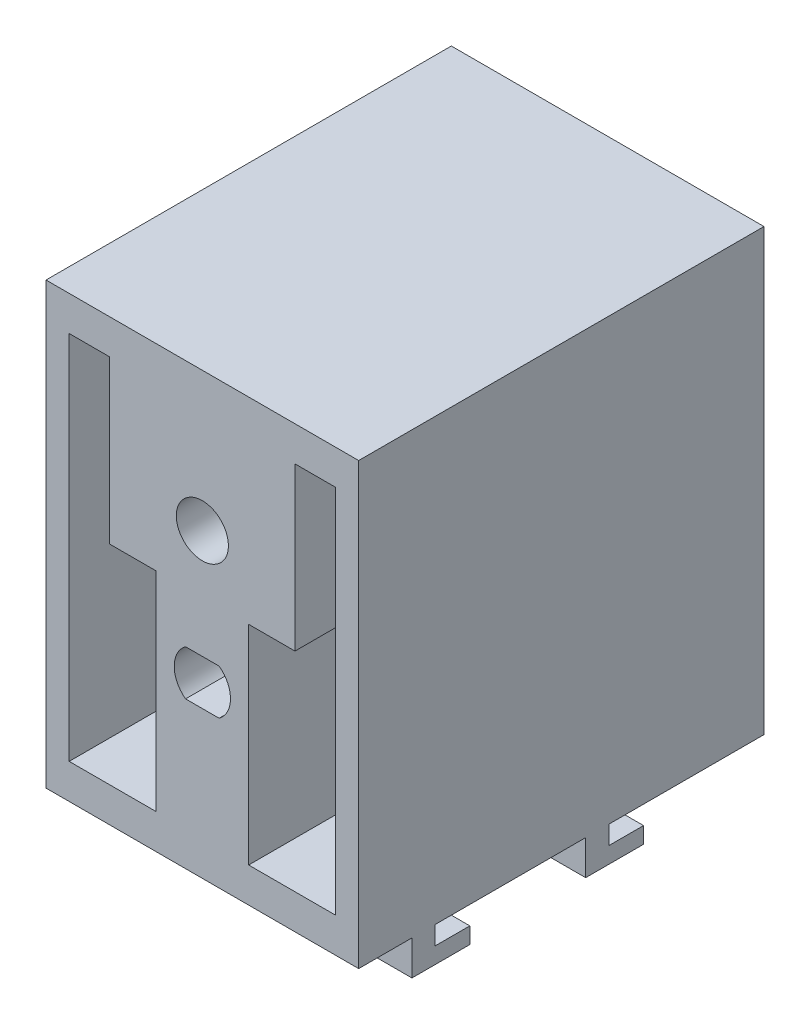
ISO-10303-21;
HEADER;
FILE_DESCRIPTION(('STEP AP214'),'2;1');
FILE_NAME('part.step','',(''),(''),'','','');
FILE_SCHEMA(('AUTOMOTIVE_DESIGN { 1 0 10303 214 1 1 1 1 }'));
ENDSEC;
DATA;
#1=APPLICATION_CONTEXT('core data for automotive mechanical design processes');
#2=APPLICATION_PROTOCOL_DEFINITION('international standard','automotive_design',2000,#1);
#3=PRODUCT_CONTEXT('',#1,'mechanical');
#4=PRODUCT('Part','Part','',(#3));
#5=PRODUCT_RELATED_PRODUCT_CATEGORY('part','',(#4));
#6=PRODUCT_DEFINITION_FORMATION('','',#4);
#7=PRODUCT_DEFINITION_CONTEXT('part definition',#1,'design');
#8=PRODUCT_DEFINITION('design','',#6,#7);
#9=PRODUCT_DEFINITION_SHAPE('','',#8);
#10=(LENGTH_UNIT() NAMED_UNIT(*) SI_UNIT(.MILLI.,.METRE.));
#11=(NAMED_UNIT(*) PLANE_ANGLE_UNIT() SI_UNIT($,.RADIAN.));
#12=(NAMED_UNIT(*) SI_UNIT($,.STERADIAN.) SOLID_ANGLE_UNIT());
#13=UNCERTAINTY_MEASURE_WITH_UNIT(LENGTH_MEASURE(1.E-05),#10,'distance_accuracy_value','');
#14=(GEOMETRIC_REPRESENTATION_CONTEXT(3) GLOBAL_UNCERTAINTY_ASSIGNED_CONTEXT((#13)) GLOBAL_UNIT_ASSIGNED_CONTEXT((#10,
#11,#12)) REPRESENTATION_CONTEXT('',''));
#15=CARTESIAN_POINT('',(0.,0.,0.));
#16=DIRECTION('',(0.,0.,1.));
#17=DIRECTION('',(1.,0.,0.));
#18=AXIS2_PLACEMENT_3D('',#15,#16,#17);
#19=CARTESIAN_POINT('',(-63.5,88.9,0.));
#20=DIRECTION('',(0.,1.,0.));
#21=DIRECTION('',(0.,0.,1.));
#22=AXIS2_PLACEMENT_3D('',#19,#20,#21);
#23=PLANE('',#22);
#24=DIRECTION('',(0.,0.,-1.));
#25=VECTOR('',#24,1.);
#26=CARTESIAN_POINT('',(-54.61,88.9,74.168));
#27=LINE('',#26,#25);
#28=CARTESIAN_POINT('',(-54.61,88.9,88.9));
#29=VERTEX_POINT('',#28);
#30=CARTESIAN_POINT('',(-54.61,88.9,61.468));
#31=VERTEX_POINT('',#30);
#32=EDGE_CURVE('E62',#29,#31,#27,.T.);
#33=ORIENTED_EDGE('',*,*,#32,.F.);
#34=DIRECTION('',(-1.,0.,0.));
#35=VECTOR('',#34,1.);
#36=CARTESIAN_POINT('',(-63.5,88.9,88.9));
#37=LINE('',#36,#35);
#38=CARTESIAN_POINT('',(-63.5,88.9,88.9));
#39=VERTEX_POINT('',#38);
#40=EDGE_CURVE('E600',#29,#39,#37,.T.);
#41=ORIENTED_EDGE('',*,*,#40,.T.);
#42=DIRECTION('',(0.,0.,1.));
#43=VECTOR('',#42,1.);
#44=CARTESIAN_POINT('',(-63.5,88.9,0.));
#45=LINE('',#44,#43);
#46=CARTESIAN_POINT('',(-63.5,88.9,0.));
#47=VERTEX_POINT('',#46);
#48=EDGE_CURVE('E603',#47,#39,#45,.T.);
#49=ORIENTED_EDGE('',*,*,#48,.F.);
#50=DIRECTION('',(-1.,0.,0.));
#51=VECTOR('',#50,1.);
#52=CARTESIAN_POINT('',(-63.5,88.9,0.));
#53=LINE('',#52,#51);
#54=CARTESIAN_POINT('',(-5.08,88.9,0.));
#55=VERTEX_POINT('',#54);
#56=EDGE_CURVE('E584',#55,#47,#53,.T.);
#57=ORIENTED_EDGE('',*,*,#56,.F.);
#58=DIRECTION('',(0.,0.,1.));
#59=VECTOR('',#58,1.);
#60=CARTESIAN_POINT('',(-5.08,88.9,0.));
#61=LINE('',#60,#59);
#62=CARTESIAN_POINT('',(-5.08,88.9,88.9));
#63=VERTEX_POINT('',#62);
#64=EDGE_CURVE('E608',#55,#63,#61,.T.);
#65=ORIENTED_EDGE('',*,*,#64,.T.);
#66=CARTESIAN_POINT('',(-13.97,88.9,88.9));
#67=VERTEX_POINT('',#66);
#68=EDGE_CURVE('E576',#63,#67,#37,.T.);
#69=ORIENTED_EDGE('',*,*,#68,.T.);
#70=DIRECTION('',(0.,0.,1.));
#71=VECTOR('',#70,1.);
#72=CARTESIAN_POINT('',(-13.97,88.9,74.168));
#73=LINE('',#72,#71);
#74=CARTESIAN_POINT('',(-13.97,88.9,61.468));
#75=VERTEX_POINT('',#74);
#76=EDGE_CURVE('E70',#75,#67,#73,.T.);
#77=ORIENTED_EDGE('',*,*,#76,.F.);
#78=DIRECTION('',(1.,0.,0.));
#79=VECTOR('',#78,1.);
#80=CARTESIAN_POINT('',(-13.97,88.9,61.468));
#81=LINE('',#80,#79);
#82=EDGE_CURVE('E359',#31,#75,#81,.T.);
#83=ORIENTED_EDGE('',*,*,#82,.F.);
#84=EDGE_LOOP('',(#33,#41,#49,#57,#65,#69,#77,#83));
#85=FACE_BOUND('',#84,.T.);
#86=ADVANCED_FACE('F45',(#85),#23,.F.);
#87=CARTESIAN_POINT('',(-63.5,7.62,0.));
#88=DIRECTION('',(0.,-1.,0.));
#89=DIRECTION('',(0.,0.,-1.));
#90=AXIS2_PLACEMENT_3D('',#87,#88,#89);
#91=PLANE('',#90);
#92=DIRECTION('',(1.,0.,0.));
#93=VECTOR('',#92,1.);
#94=CARTESIAN_POINT('',(-63.5,7.62,88.9));
#95=LINE('',#94,#93);
#96=CARTESIAN_POINT('',(-63.5,7.62,88.9));
#97=VERTEX_POINT('',#96);
#98=CARTESIAN_POINT('',(-44.45,7.62,88.9));
#99=VERTEX_POINT('',#98);
#100=EDGE_CURVE('E592',#97,#99,#95,.T.);
#101=ORIENTED_EDGE('',*,*,#100,.T.);
#102=DIRECTION('',(0.,0.,1.));
#103=VECTOR('',#102,1.);
#104=CARTESIAN_POINT('',(-44.45,7.62,63.5));
#105=LINE('',#104,#103);
#106=CARTESIAN_POINT('',(-44.45,7.62,43.18));
#107=VERTEX_POINT('',#106);
#108=EDGE_CURVE('E559',#107,#99,#105,.T.);
#109=ORIENTED_EDGE('',*,*,#108,.F.);
#110=DIRECTION('',(-1.,0.,0.));
#111=VECTOR('',#110,1.);
#112=CARTESIAN_POINT('',(-44.45,7.62,43.18));
#113=LINE('',#112,#111);
#114=CARTESIAN_POINT('',(-24.13,7.62,43.18));
#115=VERTEX_POINT('',#114);
#116=EDGE_CURVE('E522',#115,#107,#113,.T.);
#117=ORIENTED_EDGE('',*,*,#116,.F.);
#118=DIRECTION('',(0.,0.,-1.));
#119=VECTOR('',#118,1.);
#120=CARTESIAN_POINT('',(-24.13,7.62,63.5));
#121=LINE('',#120,#119);
#122=CARTESIAN_POINT('',(-24.13,7.62,88.9));
#123=VERTEX_POINT('',#122);
#124=EDGE_CURVE('E556',#123,#115,#121,.T.);
#125=ORIENTED_EDGE('',*,*,#124,.F.);
#126=CARTESIAN_POINT('',(-5.08,7.62,88.9));
#127=VERTEX_POINT('',#126);
#128=EDGE_CURVE('E591',#123,#127,#95,.T.);
#129=ORIENTED_EDGE('',*,*,#128,.T.);
#130=DIRECTION('',(0.,0.,1.));
#131=VECTOR('',#130,1.);
#132=CARTESIAN_POINT('',(-5.08,7.62,0.));
#133=LINE('',#132,#131);
#134=CARTESIAN_POINT('',(-5.08,7.62,0.));
#135=VERTEX_POINT('',#134);
#136=EDGE_CURVE('E611',#135,#127,#133,.T.);
#137=ORIENTED_EDGE('',*,*,#136,.F.);
#138=DIRECTION('',(1.,0.,0.));
#139=VECTOR('',#138,1.);
#140=CARTESIAN_POINT('',(-63.5,7.62,0.));
#141=LINE('',#140,#139);
#142=CARTESIAN_POINT('',(-63.5,7.62,0.));
#143=VERTEX_POINT('',#142);
#144=EDGE_CURVE('E575',#143,#135,#141,.T.);
#145=ORIENTED_EDGE('',*,*,#144,.F.);
#146=DIRECTION('',(0.,0.,1.));
#147=VECTOR('',#146,1.);
#148=CARTESIAN_POINT('',(-63.5,7.62,0.));
#149=LINE('',#148,#147);
#150=EDGE_CURVE('E588',#143,#97,#149,.T.);
#151=ORIENTED_EDGE('',*,*,#150,.T.);
#152=EDGE_LOOP('',(#101,#109,#117,#125,#129,#137,#145,#151));
#153=FACE_BOUND('',#152,.T.);
#154=ADVANCED_FACE('F745',(#153),#91,.F.);
#155=CARTESIAN_POINT('',(-68.58,-7.62,34.036));
#156=DIRECTION('',(0.,0.,1.));
#157=DIRECTION('',(1.,0.,0.));
#158=AXIS2_PLACEMENT_3D('',#155,#156,#157);
#159=PLANE('',#158);
#160=DIRECTION('',(1.,0.,0.));
#161=VECTOR('',#160,1.);
#162=CARTESIAN_POINT('',(-68.58,-4.064,34.036));
#163=LINE('',#162,#161);
#164=CARTESIAN_POINT('',(-68.58,-4.064,34.036));
#165=VERTEX_POINT('',#164);
#166=CARTESIAN_POINT('',(0.,-4.064,34.036));
#167=VERTEX_POINT('',#166);
#168=EDGE_CURVE('E379',#165,#167,#163,.T.);
#169=ORIENTED_EDGE('',*,*,#168,.F.);
#170=DIRECTION('',(0.,1.,0.));
#171=VECTOR('',#170,1.);
#172=CARTESIAN_POINT('',(-68.58,-7.62,34.036));
#173=LINE('',#172,#171);
#174=CARTESIAN_POINT('',(-68.58,0.,34.036));
#175=VERTEX_POINT('',#174);
#176=EDGE_CURVE('E429',#165,#175,#173,.T.);
#177=ORIENTED_EDGE('',*,*,#176,.T.);
#178=DIRECTION('',(1.,0.,0.));
#179=VECTOR('',#178,1.);
#180=CARTESIAN_POINT('',(-68.58,0.,34.036));
#181=LINE('',#180,#179);
#182=CARTESIAN_POINT('',(0.,0.,34.036));
#183=VERTEX_POINT('',#182);
#184=EDGE_CURVE('E445',#175,#183,#181,.T.);
#185=ORIENTED_EDGE('',*,*,#184,.T.);
#186=DIRECTION('',(0.,1.,0.));
#187=VECTOR('',#186,1.);
#188=CARTESIAN_POINT('',(0.,-7.62,34.036));
#189=LINE('',#188,#187);
#190=EDGE_CURVE('E463',#167,#183,#189,.T.);
#191=ORIENTED_EDGE('',*,*,#190,.F.);
#192=EDGE_LOOP('',(#169,#177,#185,#191));
#193=FACE_BOUND('',#192,.T.);
#194=ADVANCED_FACE('F674',(#193),#159,.F.);
#195=CARTESIAN_POINT('',(-68.58,-7.62,72.136));
#196=DIRECTION('',(0.,0.,1.));
#197=DIRECTION('',(1.,0.,0.));
#198=AXIS2_PLACEMENT_3D('',#195,#196,#197);
#199=PLANE('',#198);
#200=DIRECTION('',(1.,0.,0.));
#201=VECTOR('',#200,1.);
#202=CARTESIAN_POINT('',(-68.58,-4.064,72.136));
#203=LINE('',#202,#201);
#204=CARTESIAN_POINT('',(-68.58,-4.064,72.136));
#205=VERTEX_POINT('',#204);
#206=CARTESIAN_POINT('',(0.,-4.064,72.136));
#207=VERTEX_POINT('',#206);
#208=EDGE_CURVE('E404',#205,#207,#203,.T.);
#209=ORIENTED_EDGE('',*,*,#208,.F.);
#210=DIRECTION('',(0.,1.,0.));
#211=VECTOR('',#210,1.);
#212=CARTESIAN_POINT('',(-68.58,-7.62,72.136));
#213=LINE('',#212,#211);
#214=CARTESIAN_POINT('',(-68.58,0.,72.136));
#215=VERTEX_POINT('',#214);
#216=EDGE_CURVE('E293',#205,#215,#213,.T.);
#217=ORIENTED_EDGE('',*,*,#216,.T.);
#218=DIRECTION('',(1.,0.,0.));
#219=VECTOR('',#218,1.);
#220=CARTESIAN_POINT('',(-68.58,0.,72.136));
#221=LINE('',#220,#219);
#222=CARTESIAN_POINT('',(0.,0.,72.136));
#223=VERTEX_POINT('',#222);
#224=EDGE_CURVE('E441',#215,#223,#221,.T.);
#225=ORIENTED_EDGE('',*,*,#224,.T.);
#226=DIRECTION('',(0.,1.,0.));
#227=VECTOR('',#226,1.);
#228=CARTESIAN_POINT('',(0.,-7.62,72.136));
#229=LINE('',#228,#227);
#230=EDGE_CURVE('E456',#207,#223,#229,.T.);
#231=ORIENTED_EDGE('',*,*,#230,.F.);
#232=EDGE_LOOP('',(#209,#217,#225,#231));
#233=FACE_BOUND('',#232,.T.);
#234=ADVANCED_FACE('F734',(#233),#199,.F.);
#235=CARTESIAN_POINT('',(0.,0.,0.));
#236=DIRECTION('',(0.,-1.,0.));
#237=DIRECTION('',(0.,0.,-1.));
#238=AXIS2_PLACEMENT_3D('',#235,#236,#237);
#239=PLANE('',#238);
#240=DIRECTION('',(-1.,0.,0.));
#241=VECTOR('',#240,1.);
#242=CARTESIAN_POINT('',(-68.58,0.,77.216));
#243=LINE('',#242,#241);
#244=CARTESIAN_POINT('',(0.,0.,77.216));
#245=VERTEX_POINT('',#244);
#246=CARTESIAN_POINT('',(-68.58,0.,77.216));
#247=VERTEX_POINT('',#246);
#248=EDGE_CURVE('E434',#245,#247,#243,.T.);
#249=ORIENTED_EDGE('',*,*,#248,.F.);
#250=DIRECTION('',(0.,0.,-1.));
#251=VECTOR('',#250,1.);
#252=CARTESIAN_POINT('',(0.,0.,0.));
#253=LINE('',#252,#251);
#254=CARTESIAN_POINT('',(0.,0.,88.9));
#255=VERTEX_POINT('',#254);
#256=EDGE_CURVE('E633',#255,#245,#253,.T.);
#257=ORIENTED_EDGE('',*,*,#256,.F.);
#258=DIRECTION('',(1.,0.,0.));
#259=VECTOR('',#258,1.);
#260=CARTESIAN_POINT('',(0.,0.,88.9));
#261=LINE('',#260,#259);
#262=CARTESIAN_POINT('',(-68.58,0.,88.9));
#263=VERTEX_POINT('',#262);
#264=EDGE_CURVE('E623',#263,#255,#261,.T.);
#265=ORIENTED_EDGE('',*,*,#264,.F.);
#266=DIRECTION('',(0.,0.,1.));
#267=VECTOR('',#266,1.);
#268=CARTESIAN_POINT('',(-68.58,0.,0.));
#269=LINE('',#268,#267);
#270=EDGE_CURVE('E641',#247,#263,#269,.T.);
#271=ORIENTED_EDGE('',*,*,#270,.F.);
#272=EDGE_LOOP('',(#249,#257,#265,#271));
#273=FACE_BOUND('',#272,.T.);
#274=ADVANCED_FACE('F716',(#273),#239,.T.);
#275=ORIENTED_EDGE('',*,*,#224,.F.);
#276=CARTESIAN_POINT('',(-68.58,0.,39.116));
#277=VERTEX_POINT('',#276);
#278=EDGE_CURVE('E646',#277,#215,#269,.T.);
#279=ORIENTED_EDGE('',*,*,#278,.F.);
#280=DIRECTION('',(-1.,0.,0.));
#281=VECTOR('',#280,1.);
#282=CARTESIAN_POINT('',(-68.58,0.,39.116));
#283=LINE('',#282,#281);
#284=CARTESIAN_POINT('',(0.,0.,39.116));
#285=VERTEX_POINT('',#284);
#286=EDGE_CURVE('E475',#285,#277,#283,.T.);
#287=ORIENTED_EDGE('',*,*,#286,.F.);
#288=EDGE_CURVE('E638',#223,#285,#253,.T.);
#289=ORIENTED_EDGE('',*,*,#288,.F.);
#290=EDGE_LOOP('',(#275,#279,#287,#289));
#291=FACE_BOUND('',#290,.T.);
#292=ADVANCED_FACE('F698',(#291),#239,.T.);
#293=CARTESIAN_POINT('',(0.,0.,50.8));
#294=DIRECTION('',(0.,0.,1.));
#295=DIRECTION('',(1.,0.,0.));
#296=AXIS2_PLACEMENT_3D('',#293,#294,#295);
#297=PLANE('',#296);
#298=DIRECTION('',(1.,0.,0.));
#299=VECTOR('',#298,1.);
#300=CARTESIAN_POINT('',(-44.45,17.145,50.8));
#301=LINE('',#300,#299);
#302=CARTESIAN_POINT('',(-44.45,17.145,50.8));
#303=VERTEX_POINT('',#302);
#304=CARTESIAN_POINT('',(-24.13,17.145,50.8));
#305=VERTEX_POINT('',#304);
#306=EDGE_CURVE('E510',#303,#305,#301,.T.);
#307=ORIENTED_EDGE('',*,*,#306,.F.);
#308=DIRECTION('',(0.,1.,0.));
#309=VECTOR('',#308,1.);
#310=CARTESIAN_POINT('',(-44.45,26.67,50.8));
#311=LINE('',#310,#309);
#312=CARTESIAN_POINT('',(-44.45,26.67,50.8));
#313=VERTEX_POINT('',#312);
#314=EDGE_CURVE('E538',#303,#313,#311,.T.);
#315=ORIENTED_EDGE('',*,*,#314,.T.);
#316=DIRECTION('',(1.,0.,0.));
#317=VECTOR('',#316,1.);
#318=CARTESIAN_POINT('',(-44.45,26.67,50.8));
#319=LINE('',#318,#317);
#320=CARTESIAN_POINT('',(-24.13,26.67,50.8));
#321=VERTEX_POINT('',#320);
#322=EDGE_CURVE('E541',#313,#321,#319,.T.);
#323=ORIENTED_EDGE('',*,*,#322,.T.);
#324=DIRECTION('',(0.,-1.,0.));
#325=VECTOR('',#324,1.);
#326=CARTESIAN_POINT('',(-24.13,26.67,50.8));
#327=LINE('',#326,#325);
#328=EDGE_CURVE('E544',#321,#305,#327,.T.);
#329=ORIENTED_EDGE('',*,*,#328,.T.);
#330=EDGE_LOOP('',(#307,#315,#323,#329));
#331=FACE_BOUND('',#330,.T.);
#332=ADVANCED_FACE('F854',(#331),#297,.F.);
#333=CARTESIAN_POINT('',(-24.13,45.72,63.5));
#334=DIRECTION('',(0.,0.,1.));
#335=DIRECTION('',(1.,0.,0.));
#336=AXIS2_PLACEMENT_3D('',#333,#334,#335);
#337=PLANE('',#336);
#338=DIRECTION('',(-1.,0.,0.));
#339=VECTOR('',#338,1.);
#340=CARTESIAN_POINT('',(-24.13,42.164,63.5));
#341=LINE('',#340,#339);
#342=CARTESIAN_POINT('',(-30.607,42.164,63.5));
#343=VERTEX_POINT('',#342);
#344=CARTESIAN_POINT('',(-37.973,42.164,63.5));
#345=VERTEX_POINT('',#344);
#346=EDGE_CURVE('E503',#343,#345,#341,.T.);
#347=ORIENTED_EDGE('',*,*,#346,.T.);
#348=CARTESIAN_POINT('',(-34.29,37.211,63.5));
#349=DIRECTION('',(0.,0.,1.));
#350=DIRECTION('',(1.,0.,0.));
#351=AXIS2_PLACEMENT_3D('',#348,#349,#350);
#352=CIRCLE('',#351,6.17225226315322);
#353=CARTESIAN_POINT('',(-37.973,32.258,63.5));
#354=VERTEX_POINT('',#353);
#355=EDGE_CURVE('E507',#345,#354,#352,.T.);
#356=ORIENTED_EDGE('',*,*,#355,.T.);
#357=DIRECTION('',(1.,0.,0.));
#358=VECTOR('',#357,1.);
#359=CARTESIAN_POINT('',(-24.13,32.258,63.5));
#360=LINE('',#359,#358);
#361=CARTESIAN_POINT('',(-30.607,32.258,63.5));
#362=VERTEX_POINT('',#361);
#363=EDGE_CURVE('E288',#354,#362,#360,.T.);
#364=ORIENTED_EDGE('',*,*,#363,.T.);
#365=CARTESIAN_POINT('',(-34.29,37.211,63.5));
#366=DIRECTION('',(0.,0.,1.));
#367=DIRECTION('',(1.,0.,0.));
#368=AXIS2_PLACEMENT_3D('',#365,#366,#367);
#369=CIRCLE('',#368,6.17225226315322);
#370=EDGE_CURVE('E499',#362,#343,#369,.T.);
#371=ORIENTED_EDGE('',*,*,#370,.T.);
#372=EDGE_LOOP('',(#347,#356,#364,#371));
#373=FACE_BOUND('',#372,.T.);
#374=DIRECTION('',(1.,0.,0.));
#375=VECTOR('',#374,1.);
#376=CARTESIAN_POINT('',(-44.45,26.67,63.5));
#377=LINE('',#376,#375);
#378=CARTESIAN_POINT('',(-44.45,26.67,63.5));
#379=VERTEX_POINT('',#378);
#380=CARTESIAN_POINT('',(-24.13,26.67,63.5));
#381=VERTEX_POINT('',#380);
#382=EDGE_CURVE('E537',#379,#381,#377,.T.);
#383=ORIENTED_EDGE('',*,*,#382,.F.);
#384=DIRECTION('',(0.,-1.,0.));
#385=VECTOR('',#384,1.);
#386=CARTESIAN_POINT('',(-44.45,45.72,63.5));
#387=LINE('',#386,#385);
#388=CARTESIAN_POINT('',(-44.45,53.34,63.5));
#389=VERTEX_POINT('',#388);
#390=EDGE_CURVE('E562',#389,#379,#387,.T.);
#391=ORIENTED_EDGE('',*,*,#390,.F.);
#392=DIRECTION('',(-1.,0.,0.));
#393=VECTOR('',#392,1.);
#394=CARTESIAN_POINT('',(-24.13,53.34,63.5));
#395=LINE('',#394,#393);
#396=CARTESIAN_POINT('',(-24.13,53.34,63.5));
#397=VERTEX_POINT('',#396);
#398=EDGE_CURVE('E348',#397,#389,#395,.T.);
#399=ORIENTED_EDGE('',*,*,#398,.F.);
#400=DIRECTION('',(0.,-1.,0.));
#401=VECTOR('',#400,1.);
#402=CARTESIAN_POINT('',(-24.13,45.72,63.5));
#403=LINE('',#402,#401);
#404=EDGE_CURVE('E566',#397,#381,#403,.T.);
#405=ORIENTED_EDGE('',*,*,#404,.T.);
#406=EDGE_LOOP('',(#383,#391,#399,#405));
#407=FACE_BOUND('',#406,.T.);
#408=ADVANCED_FACE('F778',(#373,#407),#337,.F.);
#409=CARTESIAN_POINT('',(0.,96.52,0.));
#410=DIRECTION('',(-1.,0.,0.));
#411=DIRECTION('',(0.,0.,1.));
#412=AXIS2_PLACEMENT_3D('',#409,#410,#411);
#413=PLANE('',#412);
#414=ORIENTED_EDGE('',*,*,#256,.T.);
#415=DIRECTION('',(0.,1.,0.));
#416=VECTOR('',#415,1.);
#417=CARTESIAN_POINT('',(0.,-7.62,77.216));
#418=LINE('',#417,#416);
#419=CARTESIAN_POINT('',(0.,-7.62,77.216));
#420=VERTEX_POINT('',#419);
#421=EDGE_CURVE('E452',#420,#245,#418,.T.);
#422=ORIENTED_EDGE('',*,*,#421,.F.);
#423=DIRECTION('',(0.,0.,1.));
#424=VECTOR('',#423,1.);
#425=CARTESIAN_POINT('',(0.,-7.62,72.136));
#426=LINE('',#425,#424);
#427=CARTESIAN_POINT('',(0.,-7.62,64.516));
#428=VERTEX_POINT('',#427);
#429=EDGE_CURVE('E433',#428,#420,#426,.T.);
#430=ORIENTED_EDGE('',*,*,#429,.F.);
#431=DIRECTION('',(0.,-1.,0.));
#432=VECTOR('',#431,1.);
#433=CARTESIAN_POINT('',(0.,-4.064,64.516));
#434=LINE('',#433,#432);
#435=CARTESIAN_POINT('',(0.,-4.064,64.516));
#436=VERTEX_POINT('',#435);
#437=EDGE_CURVE('E412',#436,#428,#434,.T.);
#438=ORIENTED_EDGE('',*,*,#437,.F.);
#439=DIRECTION('',(0.,0.,1.));
#440=VECTOR('',#439,1.);
#441=CARTESIAN_POINT('',(0.,-4.064,64.516));
#442=LINE('',#441,#440);
#443=EDGE_CURVE('E420',#436,#207,#442,.T.);
#444=ORIENTED_EDGE('',*,*,#443,.T.);
#445=ORIENTED_EDGE('',*,*,#230,.T.);
#446=ORIENTED_EDGE('',*,*,#288,.T.);
#447=DIRECTION('',(0.,1.,0.));
#448=VECTOR('',#447,1.);
#449=CARTESIAN_POINT('',(0.,-7.62,39.116));
#450=LINE('',#449,#448);
#451=CARTESIAN_POINT('',(0.,-7.62,39.116));
#452=VERTEX_POINT('',#451);
#453=EDGE_CURVE('E466',#452,#285,#450,.T.);
#454=ORIENTED_EDGE('',*,*,#453,.F.);
#455=DIRECTION('',(0.,0.,1.));
#456=VECTOR('',#455,1.);
#457=CARTESIAN_POINT('',(0.,-7.62,34.036));
#458=LINE('',#457,#456);
#459=CARTESIAN_POINT('',(0.,-7.62,26.416));
#460=VERTEX_POINT('',#459);
#461=EDGE_CURVE('E485',#460,#452,#458,.T.);
#462=ORIENTED_EDGE('',*,*,#461,.F.);
#463=DIRECTION('',(0.,-1.,0.));
#464=VECTOR('',#463,1.);
#465=CARTESIAN_POINT('',(0.,-4.064,26.416));
#466=LINE('',#465,#464);
#467=CARTESIAN_POINT('',(0.,-4.064,26.416));
#468=VERTEX_POINT('',#467);
#469=EDGE_CURVE('E387',#468,#460,#466,.T.);
#470=ORIENTED_EDGE('',*,*,#469,.F.);
#471=DIRECTION('',(0.,0.,1.));
#472=VECTOR('',#471,1.);
#473=CARTESIAN_POINT('',(0.,-4.064,26.416));
#474=LINE('',#473,#472);
#475=EDGE_CURVE('E395',#468,#167,#474,.T.);
#476=ORIENTED_EDGE('',*,*,#475,.T.);
#477=ORIENTED_EDGE('',*,*,#190,.T.);
#478=CARTESIAN_POINT('',(0.,0.,0.));
#479=VERTEX_POINT('',#478);
#480=EDGE_CURVE('E607',#183,#479,#253,.T.);
#481=ORIENTED_EDGE('',*,*,#480,.T.);
#482=DIRECTION('',(0.,-1.,0.));
#483=VECTOR('',#482,1.);
#484=CARTESIAN_POINT('',(0.,96.52,0.));
#485=LINE('',#484,#483);
#486=CARTESIAN_POINT('',(0.,96.52,0.));
#487=VERTEX_POINT('',#486);
#488=EDGE_CURVE('E11',#487,#479,#485,.T.);
#489=ORIENTED_EDGE('',*,*,#488,.F.);
#490=DIRECTION('',(0.,0.,-1.));
#491=VECTOR('',#490,1.);
#492=CARTESIAN_POINT('',(0.,96.52,0.));
#493=LINE('',#492,#491);
#494=CARTESIAN_POINT('',(0.,96.52,88.9));
#495=VERTEX_POINT('',#494);
#496=EDGE_CURVE('E618',#495,#487,#493,.T.);
#497=ORIENTED_EDGE('',*,*,#496,.F.);
#498=DIRECTION('',(0.,-1.,0.));
#499=VECTOR('',#498,1.);
#500=CARTESIAN_POINT('',(0.,96.52,88.9));
#501=LINE('',#500,#499);
#502=EDGE_CURVE('E632',#495,#255,#501,.T.);
#503=ORIENTED_EDGE('',*,*,#502,.T.);
#504=EDGE_LOOP('',(#414,#422,#430,#438,#444,#445,#446,#454,#462,#470,#476,#477,#481,#489,#497,#503));
#505=FACE_BOUND('',#504,.T.);
#506=ADVANCED_FACE('F47',(#505),#413,.F.);
#507=CARTESIAN_POINT('',(0.,96.52,0.));
#508=DIRECTION('',(0.,0.,1.));
#509=DIRECTION('',(1.,0.,0.));
#510=AXIS2_PLACEMENT_3D('',#507,#508,#509);
#511=PLANE('',#510);
#512=ORIENTED_EDGE('',*,*,#56,.T.);
#513=DIRECTION('',(0.,-1.,0.));
#514=VECTOR('',#513,1.);
#515=CARTESIAN_POINT('',(-63.5,7.62,0.));
#516=LINE('',#515,#514);
#517=EDGE_CURVE('E571',#47,#143,#516,.T.);
#518=ORIENTED_EDGE('',*,*,#517,.T.);
#519=ORIENTED_EDGE('',*,*,#144,.T.);
#520=DIRECTION('',(0.,1.,0.));
#521=VECTOR('',#520,1.);
#522=CARTESIAN_POINT('',(-5.08,7.62,0.));
#523=LINE('',#522,#521);
#524=EDGE_CURVE('E580',#135,#55,#523,.T.);
#525=ORIENTED_EDGE('',*,*,#524,.T.);
#526=EDGE_LOOP('',(#512,#518,#519,#525));
#527=FACE_BOUND('',#526,.T.);
#528=DIRECTION('',(-1.,0.,0.));
#529=VECTOR('',#528,1.);
#530=CARTESIAN_POINT('',(0.,0.,0.));
#531=LINE('',#530,#529);
#532=CARTESIAN_POINT('',(-68.58,0.,0.));
#533=VERTEX_POINT('',#532);
#534=EDGE_CURVE('E637',#479,#533,#531,.T.);
#535=ORIENTED_EDGE('',*,*,#534,.T.);
#536=DIRECTION('',(0.,-1.,0.));
#537=VECTOR('',#536,1.);
#538=CARTESIAN_POINT('',(-68.58,96.52,0.));
#539=LINE('',#538,#537);
#540=CARTESIAN_POINT('',(-68.58,96.52,0.));
#541=VERTEX_POINT('',#540);
#542=EDGE_CURVE('E55',#541,#533,#539,.T.);
#543=ORIENTED_EDGE('',*,*,#542,.F.);
#544=DIRECTION('',(-1.,0.,0.));
#545=VECTOR('',#544,1.);
#546=CARTESIAN_POINT('',(0.,96.52,0.));
#547=LINE('',#546,#545);
#548=EDGE_CURVE('E622',#487,#541,#547,.T.);
#549=ORIENTED_EDGE('',*,*,#548,.F.);
#550=ORIENTED_EDGE('',*,*,#488,.T.);
#551=EDGE_LOOP('',(#535,#543,#549,#550));
#552=FACE_BOUND('',#551,.T.);
#553=ADVANCED_FACE('F705',(#527,#552),#511,.F.);
#554=CARTESIAN_POINT('',(-68.58,96.52,0.));
#555=DIRECTION('',(1.,0.,0.));
#556=DIRECTION('',(0.,0.,-1.));
#557=AXIS2_PLACEMENT_3D('',#554,#555,#556);
#558=PLANE('',#557);
#559=EDGE_CURVE('E642',#533,#175,#269,.T.);
#560=ORIENTED_EDGE('',*,*,#559,.T.);
#561=ORIENTED_EDGE('',*,*,#176,.F.);
#562=DIRECTION('',(0.,0.,1.));
#563=VECTOR('',#562,1.);
#564=CARTESIAN_POINT('',(-68.58,-4.064,26.416));
#565=LINE('',#564,#563);
#566=CARTESIAN_POINT('',(-68.58,-4.064,26.416));
#567=VERTEX_POINT('',#566);
#568=EDGE_CURVE('E401',#567,#165,#565,.T.);
#569=ORIENTED_EDGE('',*,*,#568,.F.);
#570=DIRECTION('',(0.,1.,0.));
#571=VECTOR('',#570,1.);
#572=CARTESIAN_POINT('',(-68.58,-4.064,26.416));
#573=LINE('',#572,#571);
#574=CARTESIAN_POINT('',(-68.58,-7.62,26.416));
#575=VERTEX_POINT('',#574);
#576=EDGE_CURVE('E380',#575,#567,#573,.T.);
#577=ORIENTED_EDGE('',*,*,#576,.F.);
#578=DIRECTION('',(0.,0.,-1.));
#579=VECTOR('',#578,1.);
#580=CARTESIAN_POINT('',(-68.58,-7.62,34.036));
#581=LINE('',#580,#579);
#582=CARTESIAN_POINT('',(-68.58,-7.62,39.116));
#583=VERTEX_POINT('',#582);
#584=EDGE_CURVE('E479',#583,#575,#581,.T.);
#585=ORIENTED_EDGE('',*,*,#584,.F.);
#586=DIRECTION('',(0.,1.,0.));
#587=VECTOR('',#586,1.);
#588=CARTESIAN_POINT('',(-68.58,-7.62,39.116));
#589=LINE('',#588,#587);
#590=EDGE_CURVE('E470',#583,#277,#589,.T.);
#591=ORIENTED_EDGE('',*,*,#590,.T.);
#592=ORIENTED_EDGE('',*,*,#278,.T.);
#593=ORIENTED_EDGE('',*,*,#216,.F.);
#594=DIRECTION('',(0.,0.,1.));
#595=VECTOR('',#594,1.);
#596=CARTESIAN_POINT('',(-68.58,-4.064,64.516));
#597=LINE('',#596,#595);
#598=CARTESIAN_POINT('',(-68.58,-4.064,64.516));
#599=VERTEX_POINT('',#598);
#600=EDGE_CURVE('E426',#599,#205,#597,.T.);
#601=ORIENTED_EDGE('',*,*,#600,.F.);
#602=DIRECTION('',(0.,1.,0.));
#603=VECTOR('',#602,1.);
#604=CARTESIAN_POINT('',(-68.58,-4.064,64.516));
#605=LINE('',#604,#603);
#606=CARTESIAN_POINT('',(-68.58,-7.62,64.516));
#607=VERTEX_POINT('',#606);
#608=EDGE_CURVE('E405',#607,#599,#605,.T.);
#609=ORIENTED_EDGE('',*,*,#608,.F.);
#610=DIRECTION('',(0.,0.,-1.));
#611=VECTOR('',#610,1.);
#612=CARTESIAN_POINT('',(-68.58,-7.62,72.136));
#613=LINE('',#612,#611);
#614=CARTESIAN_POINT('',(-68.58,-7.62,77.216));
#615=VERTEX_POINT('',#614);
#616=EDGE_CURVE('E430',#615,#607,#613,.T.);
#617=ORIENTED_EDGE('',*,*,#616,.F.);
#618=DIRECTION('',(0.,1.,0.));
#619=VECTOR('',#618,1.);
#620=CARTESIAN_POINT('',(-68.58,-7.62,77.216));
#621=LINE('',#620,#619);
#622=EDGE_CURVE('E440',#615,#247,#621,.T.);
#623=ORIENTED_EDGE('',*,*,#622,.T.);
#624=ORIENTED_EDGE('',*,*,#270,.T.);
#625=DIRECTION('',(0.,-1.,0.));
#626=VECTOR('',#625,1.);
#627=CARTESIAN_POINT('',(-68.58,96.52,88.9));
#628=LINE('',#627,#626);
#629=CARTESIAN_POINT('',(-68.58,96.52,88.9));
#630=VERTEX_POINT('',#629);
#631=EDGE_CURVE('E652',#630,#263,#628,.T.);
#632=ORIENTED_EDGE('',*,*,#631,.F.);
#633=DIRECTION('',(0.,0.,1.));
#634=VECTOR('',#633,1.);
#635=CARTESIAN_POINT('',(-68.58,96.52,0.));
#636=LINE('',#635,#634);
#637=EDGE_CURVE('E626',#541,#630,#636,.T.);
#638=ORIENTED_EDGE('',*,*,#637,.F.);
#639=ORIENTED_EDGE('',*,*,#542,.T.);
#640=EDGE_LOOP('',(#560,#561,#569,#577,#585,#591,#592,#593,#601,#609,#617,#623,#624,#632,#638,#639));
#641=FACE_BOUND('',#640,.T.);
#642=ADVANCED_FACE('F662',(#641),#558,.F.);
#643=CARTESIAN_POINT('',(0.,96.52,88.9));
#644=DIRECTION('',(0.,0.,-1.));
#645=DIRECTION('',(-1.,0.,0.));
#646=AXIS2_PLACEMENT_3D('',#643,#644,#645);
#647=PLANE('',#646);
#648=ORIENTED_EDGE('',*,*,#128,.F.);
#649=DIRECTION('',(0.,1.,0.));
#650=VECTOR('',#649,1.);
#651=CARTESIAN_POINT('',(-24.13,53.34,88.9));
#652=LINE('',#651,#650);
#653=CARTESIAN_POINT('',(-24.13,53.34,88.9));
#654=VERTEX_POINT('',#653);
#655=EDGE_CURVE('E332',#123,#654,#652,.T.);
#656=ORIENTED_EDGE('',*,*,#655,.T.);
#657=DIRECTION('',(1.,0.,0.));
#658=VECTOR('',#657,1.);
#659=CARTESIAN_POINT('',(-13.97,53.34,88.9));
#660=LINE('',#659,#658);
#661=CARTESIAN_POINT('',(-13.97,53.34,88.9));
#662=VERTEX_POINT('',#661);
#663=EDGE_CURVE('E336',#654,#662,#660,.T.);
#664=ORIENTED_EDGE('',*,*,#663,.T.);
#665=DIRECTION('',(0.,1.,0.));
#666=VECTOR('',#665,1.);
#667=CARTESIAN_POINT('',(-13.97,88.9,88.9));
#668=LINE('',#667,#666);
#669=EDGE_CURVE('E340',#662,#67,#668,.T.);
#670=ORIENTED_EDGE('',*,*,#669,.T.);
#671=ORIENTED_EDGE('',*,*,#68,.F.);
#672=DIRECTION('',(0.,1.,0.));
#673=VECTOR('',#672,1.);
#674=CARTESIAN_POINT('',(-5.08,7.62,88.9));
#675=LINE('',#674,#673);
#676=EDGE_CURVE('E596',#127,#63,#675,.T.);
#677=ORIENTED_EDGE('',*,*,#676,.F.);
#678=EDGE_LOOP('',(#648,#656,#664,#670,#671,#677));
#679=FACE_BOUND('',#678,.T.);
#680=ORIENTED_EDGE('',*,*,#100,.F.);
#681=DIRECTION('',(0.,-1.,0.));
#682=VECTOR('',#681,1.);
#683=CARTESIAN_POINT('',(-63.5,7.62,88.9));
#684=LINE('',#683,#682);
#685=EDGE_CURVE('E570',#39,#97,#684,.T.);
#686=ORIENTED_EDGE('',*,*,#685,.F.);
#687=ORIENTED_EDGE('',*,*,#40,.F.);
#688=DIRECTION('',(0.,-1.,0.));
#689=VECTOR('',#688,1.);
#690=CARTESIAN_POINT('',(-54.61,53.34,88.9));
#691=LINE('',#690,#689);
#692=CARTESIAN_POINT('',(-54.61,53.34,88.9));
#693=VERTEX_POINT('',#692);
#694=EDGE_CURVE('E320',#29,#693,#691,.T.);
#695=ORIENTED_EDGE('',*,*,#694,.T.);
#696=DIRECTION('',(1.,0.,0.));
#697=VECTOR('',#696,1.);
#698=CARTESIAN_POINT('',(-44.45,53.34,88.9));
#699=LINE('',#698,#697);
#700=CARTESIAN_POINT('',(-44.45,53.34,88.9));
#701=VERTEX_POINT('',#700);
#702=EDGE_CURVE('E324',#693,#701,#699,.T.);
#703=ORIENTED_EDGE('',*,*,#702,.T.);
#704=DIRECTION('',(0.,-1.,0.));
#705=VECTOR('',#704,1.);
#706=CARTESIAN_POINT('',(-44.45,7.62,88.9));
#707=LINE('',#706,#705);
#708=EDGE_CURVE('E328',#701,#99,#707,.T.);
#709=ORIENTED_EDGE('',*,*,#708,.T.);
#710=EDGE_LOOP('',(#680,#686,#687,#695,#703,#709));
#711=FACE_BOUND('',#710,.T.);
#712=ORIENTED_EDGE('',*,*,#264,.T.);
#713=ORIENTED_EDGE('',*,*,#502,.F.);
#714=DIRECTION('',(1.,0.,0.));
#715=VECTOR('',#714,1.);
#716=CARTESIAN_POINT('',(0.,96.52,88.9));
#717=LINE('',#716,#715);
#718=EDGE_CURVE('E629',#630,#495,#717,.T.);
#719=ORIENTED_EDGE('',*,*,#718,.F.);
#720=ORIENTED_EDGE('',*,*,#631,.T.);
#721=EDGE_LOOP('',(#712,#713,#719,#720));
#722=FACE_BOUND('',#721,.T.);
#723=CARTESIAN_POINT('',(-34.29,66.04,88.9));
#724=DIRECTION('',(0.,0.,1.));
#725=DIRECTION('',(1.,0.,0.));
#726=AXIS2_PLACEMENT_3D('',#723,#724,#725);
#727=CIRCLE('',#726,5.715);
#728=CARTESIAN_POINT('',(-28.575,66.04,88.9));
#729=VERTEX_POINT('',#728);
#730=EDGE_CURVE('E316',#729,#729,#727,.T.);
#731=ORIENTED_EDGE('',*,*,#730,.F.);
#732=EDGE_LOOP('',(#731));
#733=FACE_BOUND('',#732,.T.);
#734=CARTESIAN_POINT('',(-34.29,37.211,88.9));
#735=DIRECTION('',(0.,0.,1.));
#736=DIRECTION('',(1.,0.,0.));
#737=AXIS2_PLACEMENT_3D('',#734,#735,#736);
#738=CIRCLE('',#737,6.17225226315322);
#739=CARTESIAN_POINT('',(-37.973,42.164,88.9));
#740=VERTEX_POINT('',#739);
#741=CARTESIAN_POINT('',(-37.973,32.258,88.9));
#742=VERTEX_POINT('',#741);
#743=EDGE_CURVE('E296',#740,#742,#738,.T.);
#744=ORIENTED_EDGE('',*,*,#743,.F.);
#745=DIRECTION('',(-1.,0.,0.));
#746=VECTOR('',#745,1.);
#747=CARTESIAN_POINT('',(-37.973,42.164,88.9));
#748=LINE('',#747,#746);
#749=CARTESIAN_POINT('',(-30.607,42.164,88.9));
#750=VERTEX_POINT('',#749);
#751=EDGE_CURVE('E311',#750,#740,#748,.T.);
#752=ORIENTED_EDGE('',*,*,#751,.F.);
#753=CARTESIAN_POINT('',(-34.29,37.211,88.9));
#754=DIRECTION('',(0.,0.,1.));
#755=DIRECTION('',(1.,0.,0.));
#756=AXIS2_PLACEMENT_3D('',#753,#754,#755);
#757=CIRCLE('',#756,6.17225226315322);
#758=CARTESIAN_POINT('',(-30.607,32.258,88.9));
#759=VERTEX_POINT('',#758);
#760=EDGE_CURVE('E307',#759,#750,#757,.T.);
#761=ORIENTED_EDGE('',*,*,#760,.F.);
#762=DIRECTION('',(1.,0.,0.));
#763=VECTOR('',#762,1.);
#764=CARTESIAN_POINT('',(-30.607,32.258,88.9));
#765=LINE('',#764,#763);
#766=EDGE_CURVE('E285',#742,#759,#765,.T.);
#767=ORIENTED_EDGE('',*,*,#766,.F.);
#768=EDGE_LOOP('',(#744,#752,#761,#767));
#769=FACE_BOUND('',#768,.T.);
#770=ADVANCED_FACE('F305',(#679,#711,#722,#733,#769),#647,.F.);
#771=CARTESIAN_POINT('',(0.,96.52,0.));
#772=DIRECTION('',(0.,-1.,0.));
#773=DIRECTION('',(0.,0.,-1.));
#774=AXIS2_PLACEMENT_3D('',#771,#772,#773);
#775=PLANE('',#774);
#776=ORIENTED_EDGE('',*,*,#496,.T.);
#777=ORIENTED_EDGE('',*,*,#548,.T.);
#778=ORIENTED_EDGE('',*,*,#637,.T.);
#779=ORIENTED_EDGE('',*,*,#718,.T.);
#780=EDGE_LOOP('',(#776,#777,#778,#779));
#781=FACE_BOUND('',#780,.T.);
#782=ADVANCED_FACE('F707',(#781),#775,.F.);
#783=ORIENTED_EDGE('',*,*,#184,.F.);
#784=ORIENTED_EDGE('',*,*,#559,.F.);
#785=ORIENTED_EDGE('',*,*,#534,.F.);
#786=ORIENTED_EDGE('',*,*,#480,.F.);
#787=EDGE_LOOP('',(#783,#784,#785,#786));
#788=FACE_BOUND('',#787,.T.);
#789=ADVANCED_FACE('F669',(#788),#239,.T.);
#790=CARTESIAN_POINT('',(-63.5,7.62,0.));
#791=DIRECTION('',(-1.,0.,0.));
#792=DIRECTION('',(0.,0.,1.));
#793=AXIS2_PLACEMENT_3D('',#790,#791,#792);
#794=PLANE('',#793);
#795=ORIENTED_EDGE('',*,*,#685,.T.);
#796=ORIENTED_EDGE('',*,*,#150,.F.);
#797=ORIENTED_EDGE('',*,*,#517,.F.);
#798=ORIENTED_EDGE('',*,*,#48,.T.);
#799=EDGE_LOOP('',(#795,#796,#797,#798));
#800=FACE_BOUND('',#799,.T.);
#801=ADVANCED_FACE('F759',(#800),#794,.F.);
#802=CARTESIAN_POINT('',(-5.08,7.62,0.));
#803=DIRECTION('',(1.,0.,0.));
#804=DIRECTION('',(0.,0.,-1.));
#805=AXIS2_PLACEMENT_3D('',#802,#803,#804);
#806=PLANE('',#805);
#807=ORIENTED_EDGE('',*,*,#676,.T.);
#808=ORIENTED_EDGE('',*,*,#64,.F.);
#809=ORIENTED_EDGE('',*,*,#524,.F.);
#810=ORIENTED_EDGE('',*,*,#136,.T.);
#811=EDGE_LOOP('',(#807,#808,#809,#810));
#812=FACE_BOUND('',#811,.T.);
#813=ADVANCED_FACE('F757',(#812),#806,.F.);
#814=CARTESIAN_POINT('',(-24.13,45.72,63.5));
#815=DIRECTION('',(-1.,0.,0.));
#816=DIRECTION('',(0.,0.,1.));
#817=AXIS2_PLACEMENT_3D('',#814,#815,#816);
#818=PLANE('',#817);
#819=ORIENTED_EDGE('',*,*,#124,.T.);
#820=DIRECTION('',(0.,-1.,0.));
#821=VECTOR('',#820,1.);
#822=CARTESIAN_POINT('',(-24.13,17.145,43.18));
#823=LINE('',#822,#821);
#824=CARTESIAN_POINT('',(-24.13,17.145,43.18));
#825=VERTEX_POINT('',#824);
#826=EDGE_CURVE('E518',#825,#115,#823,.T.);
#827=ORIENTED_EDGE('',*,*,#826,.F.);
#828=DIRECTION('',(0.,0.,1.));
#829=VECTOR('',#828,1.);
#830=CARTESIAN_POINT('',(-24.13,17.145,43.18));
#831=LINE('',#830,#829);
#832=EDGE_CURVE('E526',#825,#305,#831,.T.);
#833=ORIENTED_EDGE('',*,*,#832,.T.);
#834=ORIENTED_EDGE('',*,*,#328,.F.);
#835=DIRECTION('',(0.,0.,1.));
#836=VECTOR('',#835,1.);
#837=CARTESIAN_POINT('',(-24.13,26.67,50.8));
#838=LINE('',#837,#836);
#839=EDGE_CURVE('E547',#321,#381,#838,.T.);
#840=ORIENTED_EDGE('',*,*,#839,.T.);
#841=ORIENTED_EDGE('',*,*,#404,.F.);
#842=DIRECTION('',(0.,0.,-1.));
#843=VECTOR('',#842,1.);
#844=CARTESIAN_POINT('',(-24.13,53.34,76.2));
#845=LINE('',#844,#843);
#846=EDGE_CURVE('E344',#654,#397,#845,.T.);
#847=ORIENTED_EDGE('',*,*,#846,.F.);
#848=ORIENTED_EDGE('',*,*,#655,.F.);
#849=EDGE_LOOP('',(#819,#827,#833,#834,#840,#841,#847,#848));
#850=FACE_BOUND('',#849,.T.);
#851=ADVANCED_FACE('F755',(#850),#818,.F.);
#852=CARTESIAN_POINT('',(-44.45,45.72,63.5));
#853=DIRECTION('',(1.,0.,0.));
#854=DIRECTION('',(0.,0.,-1.));
#855=AXIS2_PLACEMENT_3D('',#852,#853,#854);
#856=PLANE('',#855);
#857=ORIENTED_EDGE('',*,*,#108,.T.);
#858=ORIENTED_EDGE('',*,*,#708,.F.);
#859=DIRECTION('',(0.,0.,1.));
#860=VECTOR('',#859,1.);
#861=CARTESIAN_POINT('',(-44.45,53.34,76.2));
#862=LINE('',#861,#860);
#863=EDGE_CURVE('E352',#389,#701,#862,.T.);
#864=ORIENTED_EDGE('',*,*,#863,.F.);
#865=ORIENTED_EDGE('',*,*,#390,.T.);
#866=DIRECTION('',(0.,0.,1.));
#867=VECTOR('',#866,1.);
#868=CARTESIAN_POINT('',(-44.45,26.67,50.8));
#869=LINE('',#868,#867);
#870=EDGE_CURVE('E553',#313,#379,#869,.T.);
#871=ORIENTED_EDGE('',*,*,#870,.F.);
#872=ORIENTED_EDGE('',*,*,#314,.F.);
#873=DIRECTION('',(0.,0.,1.));
#874=VECTOR('',#873,1.);
#875=CARTESIAN_POINT('',(-44.45,17.145,43.18));
#876=LINE('',#875,#874);
#877=CARTESIAN_POINT('',(-44.45,17.145,43.18));
#878=VERTEX_POINT('',#877);
#879=EDGE_CURVE('E533',#878,#303,#876,.T.);
#880=ORIENTED_EDGE('',*,*,#879,.F.);
#881=DIRECTION('',(0.,1.,0.));
#882=VECTOR('',#881,1.);
#883=CARTESIAN_POINT('',(-44.45,17.145,43.18));
#884=LINE('',#883,#882);
#885=EDGE_CURVE('E511',#107,#878,#884,.T.);
#886=ORIENTED_EDGE('',*,*,#885,.F.);
#887=EDGE_LOOP('',(#857,#858,#864,#865,#871,#872,#880,#886));
#888=FACE_BOUND('',#887,.T.);
#889=ADVANCED_FACE('F811',(#888),#856,.F.);
#890=CARTESIAN_POINT('',(-44.45,26.67,50.8));
#891=DIRECTION('',(0.,-1.,0.));
#892=DIRECTION('',(0.,0.,-1.));
#893=AXIS2_PLACEMENT_3D('',#890,#891,#892);
#894=PLANE('',#893);
#895=ORIENTED_EDGE('',*,*,#382,.T.);
#896=ORIENTED_EDGE('',*,*,#839,.F.);
#897=ORIENTED_EDGE('',*,*,#322,.F.);
#898=ORIENTED_EDGE('',*,*,#870,.T.);
#899=EDGE_LOOP('',(#895,#896,#897,#898));
#900=FACE_BOUND('',#899,.T.);
#901=ADVANCED_FACE('F890',(#900),#894,.F.);
#902=CARTESIAN_POINT('',(-44.45,17.145,43.18));
#903=DIRECTION('',(0.,-1.,0.));
#904=DIRECTION('',(0.,0.,-1.));
#905=AXIS2_PLACEMENT_3D('',#902,#903,#904);
#906=PLANE('',#905);
#907=ORIENTED_EDGE('',*,*,#306,.T.);
#908=ORIENTED_EDGE('',*,*,#832,.F.);
#909=DIRECTION('',(1.,0.,0.));
#910=VECTOR('',#909,1.);
#911=CARTESIAN_POINT('',(-44.45,17.145,43.18));
#912=LINE('',#911,#910);
#913=EDGE_CURVE('E515',#878,#825,#912,.T.);
#914=ORIENTED_EDGE('',*,*,#913,.F.);
#915=ORIENTED_EDGE('',*,*,#879,.T.);
#916=EDGE_LOOP('',(#907,#908,#914,#915));
#917=FACE_BOUND('',#916,.T.);
#918=ADVANCED_FACE('F1093',(#917),#906,.F.);
#919=CARTESIAN_POINT('',(0.,0.,43.18));
#920=DIRECTION('',(0.,0.,1.));
#921=DIRECTION('',(1.,0.,0.));
#922=AXIS2_PLACEMENT_3D('',#919,#920,#921);
#923=PLANE('',#922);
#924=ORIENTED_EDGE('',*,*,#885,.T.);
#925=ORIENTED_EDGE('',*,*,#913,.T.);
#926=ORIENTED_EDGE('',*,*,#826,.T.);
#927=ORIENTED_EDGE('',*,*,#116,.T.);
#928=EDGE_LOOP('',(#924,#925,#926,#927));
#929=FACE_BOUND('',#928,.T.);
#930=ADVANCED_FACE('F924',(#929),#923,.F.);
#931=CARTESIAN_POINT('',(-34.29,37.211,0.));
#932=DIRECTION('',(0.,0.,1.));
#933=DIRECTION('',(1.,0.,0.));
#934=AXIS2_PLACEMENT_3D('',#931,#932,#933);
#935=CYLINDRICAL_SURFACE('',#934,6.17225226315322);
#936=DIRECTION('',(0.,0.,1.));
#937=VECTOR('',#936,1.);
#938=CARTESIAN_POINT('',(-37.973,42.164,0.));
#939=LINE('',#938,#937);
#940=EDGE_CURVE('E299',#345,#740,#939,.T.);
#941=ORIENTED_EDGE('',*,*,#940,.T.);
#942=ORIENTED_EDGE('',*,*,#743,.T.);
#943=DIRECTION('',(0.,0.,1.));
#944=VECTOR('',#943,1.);
#945=CARTESIAN_POINT('',(-37.973,32.258,0.));
#946=LINE('',#945,#944);
#947=EDGE_CURVE('E281',#354,#742,#946,.T.);
#948=ORIENTED_EDGE('',*,*,#947,.F.);
#949=ORIENTED_EDGE('',*,*,#355,.F.);
#950=EDGE_LOOP('',(#941,#942,#948,#949));
#951=FACE_BOUND('',#950,.T.);
#952=ADVANCED_FACE('F297',(#951),#935,.F.);
#953=CARTESIAN_POINT('',(-37.973,42.164,0.));
#954=DIRECTION('',(0.,1.,0.));
#955=DIRECTION('',(0.,0.,1.));
#956=AXIS2_PLACEMENT_3D('',#953,#954,#955);
#957=PLANE('',#956);
#958=DIRECTION('',(0.,0.,1.));
#959=VECTOR('',#958,1.);
#960=CARTESIAN_POINT('',(-30.607,42.164,0.));
#961=LINE('',#960,#959);
#962=EDGE_CURVE('E492',#343,#750,#961,.T.);
#963=ORIENTED_EDGE('',*,*,#962,.T.);
#964=ORIENTED_EDGE('',*,*,#751,.T.);
#965=ORIENTED_EDGE('',*,*,#940,.F.);
#966=ORIENTED_EDGE('',*,*,#346,.F.);
#967=EDGE_LOOP('',(#963,#964,#965,#966));
#968=FACE_BOUND('',#967,.T.);
#969=ADVANCED_FACE('F923',(#968),#957,.F.);
#970=CARTESIAN_POINT('',(-34.29,37.211,0.));
#971=DIRECTION('',(0.,0.,1.));
#972=DIRECTION('',(1.,0.,0.));
#973=AXIS2_PLACEMENT_3D('',#970,#971,#972);
#974=CYLINDRICAL_SURFACE('',#973,6.17225226315322);
#975=DIRECTION('',(0.,0.,1.));
#976=VECTOR('',#975,1.);
#977=CARTESIAN_POINT('',(-30.607,32.258,0.));
#978=LINE('',#977,#976);
#979=EDGE_CURVE('E292',#362,#759,#978,.T.);
#980=ORIENTED_EDGE('',*,*,#979,.T.);
#981=ORIENTED_EDGE('',*,*,#760,.T.);
#982=ORIENTED_EDGE('',*,*,#962,.F.);
#983=ORIENTED_EDGE('',*,*,#370,.F.);
#984=EDGE_LOOP('',(#980,#981,#982,#983));
#985=FACE_BOUND('',#984,.T.);
#986=ADVANCED_FACE('F932',(#985),#974,.F.);
#987=CARTESIAN_POINT('',(-37.973,32.258,0.));
#988=DIRECTION('',(0.,-1.,0.));
#989=DIRECTION('',(0.,0.,-1.));
#990=AXIS2_PLACEMENT_3D('',#987,#988,#989);
#991=PLANE('',#990);
#992=ORIENTED_EDGE('',*,*,#947,.T.);
#993=ORIENTED_EDGE('',*,*,#766,.T.);
#994=ORIENTED_EDGE('',*,*,#979,.F.);
#995=ORIENTED_EDGE('',*,*,#363,.F.);
#996=EDGE_LOOP('',(#992,#993,#994,#995));
#997=FACE_BOUND('',#996,.T.);
#998=ADVANCED_FACE('F283',(#997),#991,.F.);
#999=CARTESIAN_POINT('',(-68.58,-7.62,39.116));
#1000=DIRECTION('',(0.,0.,-1.));
#1001=DIRECTION('',(-1.,0.,0.));
#1002=AXIS2_PLACEMENT_3D('',#999,#1000,#1001);
#1003=PLANE('',#1002);
#1004=ORIENTED_EDGE('',*,*,#286,.T.);
#1005=ORIENTED_EDGE('',*,*,#590,.F.);
#1006=DIRECTION('',(-1.,0.,0.));
#1007=VECTOR('',#1006,1.);
#1008=CARTESIAN_POINT('',(-68.58,-7.62,39.116));
#1009=LINE('',#1008,#1007);
#1010=EDGE_CURVE('E474',#452,#583,#1009,.T.);
#1011=ORIENTED_EDGE('',*,*,#1010,.F.);
#1012=ORIENTED_EDGE('',*,*,#453,.T.);
#1013=EDGE_LOOP('',(#1004,#1005,#1011,#1012));
#1014=FACE_BOUND('',#1013,.T.);
#1015=ADVANCED_FACE('F693',(#1014),#1003,.F.);
#1016=CARTESIAN_POINT('',(0.,-7.62,0.));
#1017=DIRECTION('',(0.,1.,0.));
#1018=DIRECTION('',(0.,0.,1.));
#1019=AXIS2_PLACEMENT_3D('',#1016,#1017,#1018);
#1020=PLANE('',#1019);
#1021=ORIENTED_EDGE('',*,*,#584,.T.);
#1022=DIRECTION('',(-1.,0.,0.));
#1023=VECTOR('',#1022,1.);
#1024=CARTESIAN_POINT('',(-68.58,-7.62,26.416));
#1025=LINE('',#1024,#1023);
#1026=EDGE_CURVE('E391',#460,#575,#1025,.T.);
#1027=ORIENTED_EDGE('',*,*,#1026,.F.);
#1028=ORIENTED_EDGE('',*,*,#461,.T.);
#1029=ORIENTED_EDGE('',*,*,#1010,.T.);
#1030=EDGE_LOOP('',(#1021,#1027,#1028,#1029));
#1031=FACE_BOUND('',#1030,.T.);
#1032=ADVANCED_FACE('F686',(#1031),#1020,.F.);
#1033=CARTESIAN_POINT('',(-68.58,-7.62,77.216));
#1034=DIRECTION('',(0.,0.,-1.));
#1035=DIRECTION('',(-1.,0.,0.));
#1036=AXIS2_PLACEMENT_3D('',#1033,#1034,#1035);
#1037=PLANE('',#1036);
#1038=ORIENTED_EDGE('',*,*,#248,.T.);
#1039=ORIENTED_EDGE('',*,*,#622,.F.);
#1040=DIRECTION('',(-1.,0.,0.));
#1041=VECTOR('',#1040,1.);
#1042=CARTESIAN_POINT('',(-68.58,-7.62,77.216));
#1043=LINE('',#1042,#1041);
#1044=EDGE_CURVE('E437',#420,#615,#1043,.T.);
#1045=ORIENTED_EDGE('',*,*,#1044,.F.);
#1046=ORIENTED_EDGE('',*,*,#421,.T.);
#1047=EDGE_LOOP('',(#1038,#1039,#1045,#1046));
#1048=FACE_BOUND('',#1047,.T.);
#1049=ADVANCED_FACE('F719',(#1048),#1037,.F.);
#1050=CARTESIAN_POINT('',(0.,-7.62,0.));
#1051=DIRECTION('',(0.,1.,0.));
#1052=DIRECTION('',(0.,0.,1.));
#1053=AXIS2_PLACEMENT_3D('',#1050,#1051,#1052);
#1054=PLANE('',#1053);
#1055=ORIENTED_EDGE('',*,*,#616,.T.);
#1056=DIRECTION('',(-1.,0.,0.));
#1057=VECTOR('',#1056,1.);
#1058=CARTESIAN_POINT('',(-68.58,-7.62,64.516));
#1059=LINE('',#1058,#1057);
#1060=EDGE_CURVE('E416',#428,#607,#1059,.T.);
#1061=ORIENTED_EDGE('',*,*,#1060,.F.);
#1062=ORIENTED_EDGE('',*,*,#429,.T.);
#1063=ORIENTED_EDGE('',*,*,#1044,.T.);
#1064=EDGE_LOOP('',(#1055,#1061,#1062,#1063));
#1065=FACE_BOUND('',#1064,.T.);
#1066=ADVANCED_FACE('F726',(#1065),#1054,.F.);
#1067=CARTESIAN_POINT('',(-68.58,-4.064,64.516));
#1068=DIRECTION('',(0.,-1.,0.));
#1069=DIRECTION('',(0.,0.,-1.));
#1070=AXIS2_PLACEMENT_3D('',#1067,#1068,#1069);
#1071=PLANE('',#1070);
#1072=ORIENTED_EDGE('',*,*,#208,.T.);
#1073=ORIENTED_EDGE('',*,*,#443,.F.);
#1074=DIRECTION('',(1.,0.,0.));
#1075=VECTOR('',#1074,1.);
#1076=CARTESIAN_POINT('',(-68.58,-4.064,64.516));
#1077=LINE('',#1076,#1075);
#1078=EDGE_CURVE('E409',#599,#436,#1077,.T.);
#1079=ORIENTED_EDGE('',*,*,#1078,.F.);
#1080=ORIENTED_EDGE('',*,*,#600,.T.);
#1081=EDGE_LOOP('',(#1072,#1073,#1079,#1080));
#1082=FACE_BOUND('',#1081,.T.);
#1083=ADVANCED_FACE('F735',(#1082),#1071,.F.);
#1084=CARTESIAN_POINT('',(0.,0.,64.516));
#1085=DIRECTION('',(0.,0.,1.));
#1086=DIRECTION('',(1.,0.,0.));
#1087=AXIS2_PLACEMENT_3D('',#1084,#1085,#1086);
#1088=PLANE('',#1087);
#1089=ORIENTED_EDGE('',*,*,#608,.T.);
#1090=ORIENTED_EDGE('',*,*,#1078,.T.);
#1091=ORIENTED_EDGE('',*,*,#437,.T.);
#1092=ORIENTED_EDGE('',*,*,#1060,.T.);
#1093=EDGE_LOOP('',(#1089,#1090,#1091,#1092));
#1094=FACE_BOUND('',#1093,.T.);
#1095=ADVANCED_FACE('F728',(#1094),#1088,.F.);
#1096=CARTESIAN_POINT('',(-68.58,-4.064,26.416));
#1097=DIRECTION('',(0.,-1.,0.));
#1098=DIRECTION('',(0.,0.,-1.));
#1099=AXIS2_PLACEMENT_3D('',#1096,#1097,#1098);
#1100=PLANE('',#1099);
#1101=ORIENTED_EDGE('',*,*,#168,.T.);
#1102=ORIENTED_EDGE('',*,*,#475,.F.);
#1103=DIRECTION('',(1.,0.,0.));
#1104=VECTOR('',#1103,1.);
#1105=CARTESIAN_POINT('',(-68.58,-4.064,26.416));
#1106=LINE('',#1105,#1104);
#1107=EDGE_CURVE('E384',#567,#468,#1106,.T.);
#1108=ORIENTED_EDGE('',*,*,#1107,.F.);
#1109=ORIENTED_EDGE('',*,*,#568,.T.);
#1110=EDGE_LOOP('',(#1101,#1102,#1108,#1109));
#1111=FACE_BOUND('',#1110,.T.);
#1112=ADVANCED_FACE('F679',(#1111),#1100,.F.);
#1113=CARTESIAN_POINT('',(0.,0.,26.416));
#1114=DIRECTION('',(0.,0.,1.));
#1115=DIRECTION('',(1.,0.,0.));
#1116=AXIS2_PLACEMENT_3D('',#1113,#1114,#1115);
#1117=PLANE('',#1116);
#1118=ORIENTED_EDGE('',*,*,#576,.T.);
#1119=ORIENTED_EDGE('',*,*,#1107,.T.);
#1120=ORIENTED_EDGE('',*,*,#469,.T.);
#1121=ORIENTED_EDGE('',*,*,#1026,.T.);
#1122=EDGE_LOOP('',(#1118,#1119,#1120,#1121));
#1123=FACE_BOUND('',#1122,.T.);
#1124=ADVANCED_FACE('F683',(#1123),#1117,.F.);
#1125=CARTESIAN_POINT('',(-13.97,53.34,74.168));
#1126=DIRECTION('',(-1.,0.,0.));
#1127=DIRECTION('',(0.,0.,1.));
#1128=AXIS2_PLACEMENT_3D('',#1125,#1126,#1127);
#1129=PLANE('',#1128);
#1130=ORIENTED_EDGE('',*,*,#76,.T.);
#1131=ORIENTED_EDGE('',*,*,#669,.F.);
#1132=DIRECTION('',(0.,0.,1.));
#1133=VECTOR('',#1132,1.);
#1134=CARTESIAN_POINT('',(-13.97,53.34,74.168));
#1135=LINE('',#1134,#1133);
#1136=CARTESIAN_POINT('',(-13.97,53.34,61.468));
#1137=VERTEX_POINT('',#1136);
#1138=EDGE_CURVE('E355',#1137,#662,#1135,.T.);
#1139=ORIENTED_EDGE('',*,*,#1138,.F.);
#1140=DIRECTION('',(0.,1.,0.));
#1141=VECTOR('',#1140,1.);
#1142=CARTESIAN_POINT('',(-13.97,53.34,61.468));
#1143=LINE('',#1142,#1141);
#1144=EDGE_CURVE('E365',#1137,#75,#1143,.T.);
#1145=ORIENTED_EDGE('',*,*,#1144,.T.);
#1146=EDGE_LOOP('',(#1130,#1131,#1139,#1145));
#1147=FACE_BOUND('',#1146,.T.);
#1148=ADVANCED_FACE('F796',(#1147),#1129,.F.);
#1149=CARTESIAN_POINT('',(-54.61,53.34,74.168));
#1150=DIRECTION('',(1.,0.,0.));
#1151=DIRECTION('',(0.,0.,-1.));
#1152=AXIS2_PLACEMENT_3D('',#1149,#1150,#1151);
#1153=PLANE('',#1152);
#1154=ORIENTED_EDGE('',*,*,#32,.T.);
#1155=DIRECTION('',(0.,1.,0.));
#1156=VECTOR('',#1155,1.);
#1157=CARTESIAN_POINT('',(-54.61,53.34,61.468));
#1158=LINE('',#1157,#1156);
#1159=CARTESIAN_POINT('',(-54.61,53.34,61.468));
#1160=VERTEX_POINT('',#1159);
#1161=EDGE_CURVE('E375',#1160,#31,#1158,.T.);
#1162=ORIENTED_EDGE('',*,*,#1161,.F.);
#1163=DIRECTION('',(0.,0.,-1.));
#1164=VECTOR('',#1163,1.);
#1165=CARTESIAN_POINT('',(-54.61,53.34,74.168));
#1166=LINE('',#1165,#1164);
#1167=EDGE_CURVE('E358',#693,#1160,#1166,.T.);
#1168=ORIENTED_EDGE('',*,*,#1167,.F.);
#1169=ORIENTED_EDGE('',*,*,#694,.F.);
#1170=EDGE_LOOP('',(#1154,#1162,#1168,#1169));
#1171=FACE_BOUND('',#1170,.T.);
#1172=ADVANCED_FACE('F815',(#1171),#1153,.F.);
#1173=CARTESIAN_POINT('',(-13.97,53.34,61.468));
#1174=DIRECTION('',(0.,0.,1.));
#1175=DIRECTION('',(1.,0.,0.));
#1176=AXIS2_PLACEMENT_3D('',#1173,#1174,#1175);
#1177=PLANE('',#1176);
#1178=CARTESIAN_POINT('',(-34.29,66.04,61.468));
#1179=DIRECTION('',(0.,0.,1.));
#1180=DIRECTION('',(1.,0.,0.));
#1181=AXIS2_PLACEMENT_3D('',#1178,#1179,#1180);
#1182=CIRCLE('',#1181,5.715);
#1183=CARTESIAN_POINT('',(-28.575,66.04,61.468));
#1184=VERTEX_POINT('',#1183);
#1185=EDGE_CURVE('E49',#1184,#1184,#1182,.T.);
#1186=ORIENTED_EDGE('',*,*,#1185,.T.);
#1187=EDGE_LOOP('',(#1186));
#1188=FACE_BOUND('',#1187,.T.);
#1189=ORIENTED_EDGE('',*,*,#82,.T.);
#1190=ORIENTED_EDGE('',*,*,#1144,.F.);
#1191=DIRECTION('',(1.,0.,0.));
#1192=VECTOR('',#1191,1.);
#1193=CARTESIAN_POINT('',(-13.97,53.34,61.468));
#1194=LINE('',#1193,#1192);
#1195=EDGE_CURVE('E362',#1160,#1137,#1194,.T.);
#1196=ORIENTED_EDGE('',*,*,#1195,.F.);
#1197=ORIENTED_EDGE('',*,*,#1161,.T.);
#1198=EDGE_LOOP('',(#1189,#1190,#1196,#1197));
#1199=FACE_BOUND('',#1198,.T.);
#1200=ADVANCED_FACE('F792',(#1188,#1199),#1177,.F.);
#1201=CARTESIAN_POINT('',(0.,53.34,0.));
#1202=DIRECTION('',(0.,1.,0.));
#1203=DIRECTION('',(0.,0.,1.));
#1204=AXIS2_PLACEMENT_3D('',#1201,#1202,#1203);
#1205=PLANE('',#1204);
#1206=ORIENTED_EDGE('',*,*,#1138,.T.);
#1207=ORIENTED_EDGE('',*,*,#663,.F.);
#1208=ORIENTED_EDGE('',*,*,#846,.T.);
#1209=ORIENTED_EDGE('',*,*,#398,.T.);
#1210=ORIENTED_EDGE('',*,*,#863,.T.);
#1211=ORIENTED_EDGE('',*,*,#702,.F.);
#1212=ORIENTED_EDGE('',*,*,#1167,.T.);
#1213=ORIENTED_EDGE('',*,*,#1195,.T.);
#1214=EDGE_LOOP('',(#1206,#1207,#1208,#1209,#1210,#1211,#1212,#1213));
#1215=FACE_BOUND('',#1214,.T.);
#1216=ADVANCED_FACE('F799',(#1215),#1205,.F.);
#1217=CARTESIAN_POINT('',(-34.29,66.04,0.));
#1218=DIRECTION('',(0.,0.,1.));
#1219=DIRECTION('',(1.,0.,0.));
#1220=AXIS2_PLACEMENT_3D('',#1217,#1218,#1219);
#1221=CYLINDRICAL_SURFACE('',#1220,5.715);
#1222=ORIENTED_EDGE('',*,*,#1185,.F.);
#1223=EDGE_LOOP('',(#1222));
#1224=FACE_BOUND('',#1223,.T.);
#1225=ORIENTED_EDGE('',*,*,#730,.T.);
#1226=EDGE_LOOP('',(#1225));
#1227=FACE_BOUND('',#1226,.T.);
#1228=ADVANCED_FACE('F865',(#1224,#1227),#1221,.F.);
#1229=CLOSED_SHELL('',(#86,#154,#194,#234,#274,#292,#332,#408,#506,#553,#642,#770,#782,#789,
#801,#813,#851,#889,#901,#918,#930,#952,#969,#986,#998,#1015,#1032,#1049,#1066,#1083,#1095,
#1112,#1124,#1148,#1172,#1200,#1216,#1228));
#1230=MANIFOLD_SOLID_BREP('B2',#1229);
#1231=ADVANCED_BREP_SHAPE_REPRESENTATION('',(#18,#1230),#14);
#1232=SHAPE_DEFINITION_REPRESENTATION(#9,#1231);
ENDSEC;
END-ISO-10303-21;
